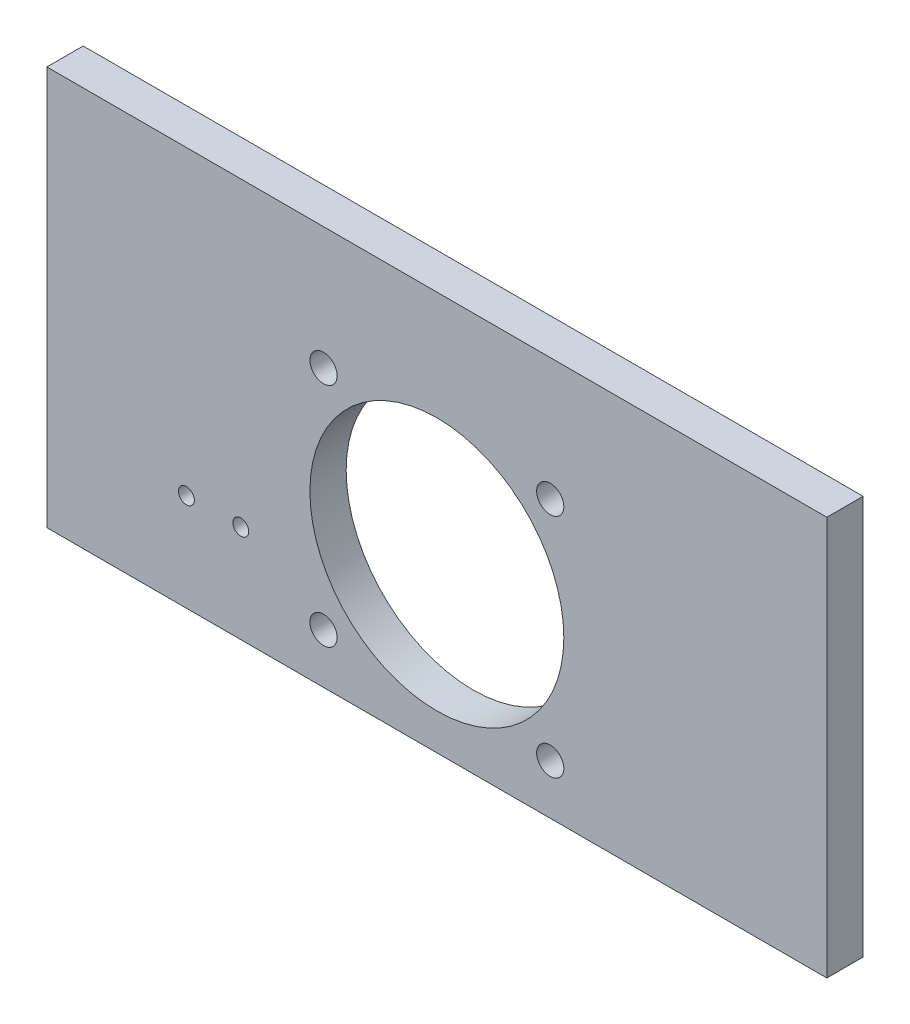
ISO-10303-21;
HEADER;
FILE_DESCRIPTION(('STEP AP214'),'2;1');
FILE_NAME('part.step','',(''),(''),'','','');
FILE_SCHEMA(('AUTOMOTIVE_DESIGN { 1 0 10303 214 1 1 1 1 }'));
ENDSEC;
DATA;
#1=APPLICATION_CONTEXT('core data for automotive mechanical design processes');
#2=APPLICATION_PROTOCOL_DEFINITION('international standard','automotive_design',2000,#1);
#3=PRODUCT_CONTEXT('',#1,'mechanical');
#4=PRODUCT('Part','Part','',(#3));
#5=PRODUCT_RELATED_PRODUCT_CATEGORY('part','',(#4));
#6=PRODUCT_DEFINITION_FORMATION('','',#4);
#7=PRODUCT_DEFINITION_CONTEXT('part definition',#1,'design');
#8=PRODUCT_DEFINITION('design','',#6,#7);
#9=PRODUCT_DEFINITION_SHAPE('','',#8);
#10=(LENGTH_UNIT() NAMED_UNIT(*) SI_UNIT(.MILLI.,.METRE.));
#11=(NAMED_UNIT(*) PLANE_ANGLE_UNIT() SI_UNIT($,.RADIAN.));
#12=(NAMED_UNIT(*) SI_UNIT($,.STERADIAN.) SOLID_ANGLE_UNIT());
#13=UNCERTAINTY_MEASURE_WITH_UNIT(LENGTH_MEASURE(1.E-05),#10,'distance_accuracy_value','');
#14=(GEOMETRIC_REPRESENTATION_CONTEXT(3) GLOBAL_UNCERTAINTY_ASSIGNED_CONTEXT((#13)) GLOBAL_UNIT_ASSIGNED_CONTEXT((#10,
#11,#12)) REPRESENTATION_CONTEXT('',''));
#15=CARTESIAN_POINT('',(0.,0.,0.));
#16=DIRECTION('',(0.,0.,1.));
#17=DIRECTION('',(1.,0.,0.));
#18=AXIS2_PLACEMENT_3D('',#15,#16,#17);
#19=CARTESIAN_POINT('',(0.,0.,4.));
#20=DIRECTION('',(1.,0.,0.));
#21=DIRECTION('',(0.,0.,-1.));
#22=AXIS2_PLACEMENT_3D('',#19,#20,#21);
#23=PLANE('',#22);
#24=DIRECTION('',(0.,-1.,0.));
#25=VECTOR('',#24,1.);
#26=CARTESIAN_POINT('',(0.,0.,0.));
#27=LINE('',#26,#25);
#28=CARTESIAN_POINT('',(0.,44.,0.));
#29=VERTEX_POINT('',#28);
#30=CARTESIAN_POINT('',(0.,0.,0.));
#31=VERTEX_POINT('',#30);
#32=EDGE_CURVE('E97',#29,#31,#27,.T.);
#33=ORIENTED_EDGE('',*,*,#32,.T.);
#34=DIRECTION('',(0.,0.,-1.));
#35=VECTOR('',#34,1.);
#36=CARTESIAN_POINT('',(0.,0.,4.));
#37=LINE('',#36,#35);
#38=CARTESIAN_POINT('',(0.,0.,4.));
#39=VERTEX_POINT('',#38);
#40=EDGE_CURVE('E11',#39,#31,#37,.T.);
#41=ORIENTED_EDGE('',*,*,#40,.F.);
#42=DIRECTION('',(0.,-1.,0.));
#43=VECTOR('',#42,1.);
#44=CARTESIAN_POINT('',(0.,0.,4.));
#45=LINE('',#44,#43);
#46=CARTESIAN_POINT('',(0.,44.,4.));
#47=VERTEX_POINT('',#46);
#48=EDGE_CURVE('E85',#47,#39,#45,.T.);
#49=ORIENTED_EDGE('',*,*,#48,.F.);
#50=DIRECTION('',(0.,0.,-1.));
#51=VECTOR('',#50,1.);
#52=CARTESIAN_POINT('',(0.,44.,4.));
#53=LINE('',#52,#51);
#54=EDGE_CURVE('E93',#47,#29,#53,.T.);
#55=ORIENTED_EDGE('',*,*,#54,.T.);
#56=EDGE_LOOP('',(#33,#41,#49,#55));
#57=FACE_BOUND('',#56,.T.);
#58=ADVANCED_FACE('F34',(#57),#23,.F.);
#59=CARTESIAN_POINT('',(0.,0.,4.));
#60=DIRECTION('',(0.,1.,0.));
#61=DIRECTION('',(0.,0.,1.));
#62=AXIS2_PLACEMENT_3D('',#59,#60,#61);
#63=PLANE('',#62);
#64=DIRECTION('',(1.,0.,0.));
#65=VECTOR('',#64,1.);
#66=CARTESIAN_POINT('',(0.,0.,0.));
#67=LINE('',#66,#65);
#68=CARTESIAN_POINT('',(86.,0.,0.));
#69=VERTEX_POINT('',#68);
#70=EDGE_CURVE('E89',#31,#69,#67,.T.);
#71=ORIENTED_EDGE('',*,*,#70,.T.);
#72=DIRECTION('',(0.,0.,-1.));
#73=VECTOR('',#72,1.);
#74=CARTESIAN_POINT('',(86.,0.,4.));
#75=LINE('',#74,#73);
#76=CARTESIAN_POINT('',(86.,0.,4.));
#77=VERTEX_POINT('',#76);
#78=EDGE_CURVE('E42',#77,#69,#75,.T.);
#79=ORIENTED_EDGE('',*,*,#78,.F.);
#80=DIRECTION('',(1.,0.,0.));
#81=VECTOR('',#80,1.);
#82=CARTESIAN_POINT('',(0.,0.,4.));
#83=LINE('',#82,#81);
#84=EDGE_CURVE('E80',#39,#77,#83,.T.);
#85=ORIENTED_EDGE('',*,*,#84,.F.);
#86=ORIENTED_EDGE('',*,*,#40,.T.);
#87=EDGE_LOOP('',(#71,#79,#85,#86));
#88=FACE_BOUND('',#87,.T.);
#89=ADVANCED_FACE('F88',(#88),#63,.F.);
#90=CARTESIAN_POINT('',(86.,0.,4.));
#91=DIRECTION('',(-1.,0.,0.));
#92=DIRECTION('',(0.,0.,1.));
#93=AXIS2_PLACEMENT_3D('',#90,#91,#92);
#94=PLANE('',#93);
#95=DIRECTION('',(0.,1.,0.));
#96=VECTOR('',#95,1.);
#97=CARTESIAN_POINT('',(86.,0.,0.));
#98=LINE('',#97,#96);
#99=CARTESIAN_POINT('',(86.,44.,0.));
#100=VERTEX_POINT('',#99);
#101=EDGE_CURVE('E67',#69,#100,#98,.T.);
#102=ORIENTED_EDGE('',*,*,#101,.T.);
#103=DIRECTION('',(0.,0.,-1.));
#104=VECTOR('',#103,1.);
#105=CARTESIAN_POINT('',(86.,44.,4.));
#106=LINE('',#105,#104);
#107=CARTESIAN_POINT('',(86.,44.,4.));
#108=VERTEX_POINT('',#107);
#109=EDGE_CURVE('E90',#108,#100,#106,.T.);
#110=ORIENTED_EDGE('',*,*,#109,.F.);
#111=DIRECTION('',(0.,1.,0.));
#112=VECTOR('',#111,1.);
#113=CARTESIAN_POINT('',(86.,0.,4.));
#114=LINE('',#113,#112);
#115=EDGE_CURVE('E83',#77,#108,#114,.T.);
#116=ORIENTED_EDGE('',*,*,#115,.F.);
#117=ORIENTED_EDGE('',*,*,#78,.T.);
#118=EDGE_LOOP('',(#102,#110,#116,#117));
#119=FACE_BOUND('',#118,.T.);
#120=ADVANCED_FACE('F91',(#119),#94,.F.);
#121=CARTESIAN_POINT('',(0.,44.,4.));
#122=DIRECTION('',(0.,-1.,0.));
#123=DIRECTION('',(0.,0.,-1.));
#124=AXIS2_PLACEMENT_3D('',#121,#122,#123);
#125=PLANE('',#124);
#126=DIRECTION('',(-1.,0.,0.));
#127=VECTOR('',#126,1.);
#128=CARTESIAN_POINT('',(0.,44.,0.));
#129=LINE('',#128,#127);
#130=EDGE_CURVE('E73',#100,#29,#129,.T.);
#131=ORIENTED_EDGE('',*,*,#130,.T.);
#132=ORIENTED_EDGE('',*,*,#54,.F.);
#133=DIRECTION('',(-1.,0.,0.));
#134=VECTOR('',#133,1.);
#135=CARTESIAN_POINT('',(0.,44.,4.));
#136=LINE('',#135,#134);
#137=EDGE_CURVE('E50',#108,#47,#136,.T.);
#138=ORIENTED_EDGE('',*,*,#137,.F.);
#139=ORIENTED_EDGE('',*,*,#109,.T.);
#140=EDGE_LOOP('',(#131,#132,#138,#139));
#141=FACE_BOUND('',#140,.T.);
#142=ADVANCED_FACE('F105',(#141),#125,.F.);
#143=CARTESIAN_POINT('',(0.,0.,4.));
#144=DIRECTION('',(0.,0.,-1.));
#145=DIRECTION('',(-1.,0.,0.));
#146=AXIS2_PLACEMENT_3D('',#143,#144,#145);
#147=PLANE('',#146);
#148=CARTESIAN_POINT('',(15.38,10.75,4.));
#149=DIRECTION('',(0.,0.,1.));
#150=DIRECTION('',(1.,0.,0.));
#151=AXIS2_PLACEMENT_3D('',#148,#149,#150);
#152=CIRCLE('',#151,0.875000000000001);
#153=CARTESIAN_POINT('',(16.255,10.75,4.));
#154=VERTEX_POINT('',#153);
#155=EDGE_CURVE('E149',#154,#154,#152,.T.);
#156=ORIENTED_EDGE('',*,*,#155,.F.);
#157=EDGE_LOOP('',(#156));
#158=FACE_BOUND('',#157,.T.);
#159=CARTESIAN_POINT('',(21.38,10.75,4.));
#160=DIRECTION('',(0.,0.,1.));
#161=DIRECTION('',(1.,0.,0.));
#162=AXIS2_PLACEMENT_3D('',#159,#160,#161);
#163=CIRCLE('',#162,0.875000000000001);
#164=CARTESIAN_POINT('',(22.255,10.75,4.));
#165=VERTEX_POINT('',#164);
#166=EDGE_CURVE('E143',#165,#165,#163,.T.);
#167=ORIENTED_EDGE('',*,*,#166,.F.);
#168=EDGE_LOOP('',(#167));
#169=FACE_BOUND('',#168,.T.);
#170=CARTESIAN_POINT('',(30.4999999999999,5.50000000000013,4.));
#171=DIRECTION('',(0.,0.,1.));
#172=DIRECTION('',(1.,0.,0.));
#173=AXIS2_PLACEMENT_3D('',#170,#171,#172);
#174=CIRCLE('',#173,1.50000000000002);
#175=CARTESIAN_POINT('',(31.9999999999999,5.50000000000013,4.));
#176=VERTEX_POINT('',#175);
#177=EDGE_CURVE('E123',#176,#176,#174,.T.);
#178=ORIENTED_EDGE('',*,*,#177,.F.);
#179=EDGE_LOOP('',(#178));
#180=FACE_BOUND('',#179,.T.);
#181=CARTESIAN_POINT('',(55.4999999999999,5.4999999999999,4.));
#182=DIRECTION('',(0.,0.,1.));
#183=DIRECTION('',(1.,0.,0.));
#184=AXIS2_PLACEMENT_3D('',#181,#182,#183);
#185=CIRCLE('',#184,1.50000000000002);
#186=CARTESIAN_POINT('',(56.9999999999999,5.4999999999999,4.));
#187=VERTEX_POINT('',#186);
#188=EDGE_CURVE('E130',#187,#187,#185,.T.);
#189=ORIENTED_EDGE('',*,*,#188,.F.);
#190=EDGE_LOOP('',(#189));
#191=FACE_BOUND('',#190,.T.);
#192=CARTESIAN_POINT('',(55.5,30.5,4.));
#193=DIRECTION('',(0.,0.,1.));
#194=DIRECTION('',(1.,0.,0.));
#195=AXIS2_PLACEMENT_3D('',#192,#193,#194);
#196=CIRCLE('',#195,1.50000000000002);
#197=CARTESIAN_POINT('',(57.,30.5,4.));
#198=VERTEX_POINT('',#197);
#199=EDGE_CURVE('E136',#198,#198,#196,.T.);
#200=ORIENTED_EDGE('',*,*,#199,.F.);
#201=EDGE_LOOP('',(#200));
#202=FACE_BOUND('',#201,.T.);
#203=CARTESIAN_POINT('',(30.5,30.5,4.));
#204=DIRECTION('',(0.,0.,1.));
#205=DIRECTION('',(1.,0.,0.));
#206=AXIS2_PLACEMENT_3D('',#203,#204,#205);
#207=CIRCLE('',#206,1.50000000000002);
#208=CARTESIAN_POINT('',(32.,30.5,4.));
#209=VERTEX_POINT('',#208);
#210=EDGE_CURVE('E117',#209,#209,#207,.T.);
#211=ORIENTED_EDGE('',*,*,#210,.F.);
#212=EDGE_LOOP('',(#211));
#213=FACE_BOUND('',#212,.T.);
#214=CARTESIAN_POINT('',(43.,18.,4.));
#215=DIRECTION('',(0.,0.,1.));
#216=DIRECTION('',(1.,0.,0.));
#217=AXIS2_PLACEMENT_3D('',#214,#215,#216);
#218=CIRCLE('',#217,14.);
#219=CARTESIAN_POINT('',(57.,18.,4.));
#220=VERTEX_POINT('',#219);
#221=EDGE_CURVE('E111',#220,#220,#218,.T.);
#222=ORIENTED_EDGE('',*,*,#221,.F.);
#223=EDGE_LOOP('',(#222));
#224=FACE_BOUND('',#223,.T.);
#225=ORIENTED_EDGE('',*,*,#48,.T.);
#226=ORIENTED_EDGE('',*,*,#84,.T.);
#227=ORIENTED_EDGE('',*,*,#115,.T.);
#228=ORIENTED_EDGE('',*,*,#137,.T.);
#229=EDGE_LOOP('',(#225,#226,#227,#228));
#230=FACE_BOUND('',#229,.T.);
#231=ADVANCED_FACE('F81',(#158,#169,#180,#191,#202,#213,#224,#230),#147,.F.);
#232=CARTESIAN_POINT('',(0.,0.,0.));
#233=DIRECTION('',(0.,0.,-1.));
#234=DIRECTION('',(-1.,0.,0.));
#235=AXIS2_PLACEMENT_3D('',#232,#233,#234);
#236=PLANE('',#235);
#237=CARTESIAN_POINT('',(15.38,10.75,0.));
#238=DIRECTION('',(0.,0.,1.));
#239=DIRECTION('',(1.,0.,0.));
#240=AXIS2_PLACEMENT_3D('',#237,#238,#239);
#241=CIRCLE('',#240,0.875000000000001);
#242=CARTESIAN_POINT('',(16.255,10.75,0.));
#243=VERTEX_POINT('',#242);
#244=EDGE_CURVE('E146',#243,#243,#241,.T.);
#245=ORIENTED_EDGE('',*,*,#244,.T.);
#246=EDGE_LOOP('',(#245));
#247=FACE_BOUND('',#246,.T.);
#248=CARTESIAN_POINT('',(21.38,10.75,0.));
#249=DIRECTION('',(0.,0.,1.));
#250=DIRECTION('',(1.,0.,0.));
#251=AXIS2_PLACEMENT_3D('',#248,#249,#250);
#252=CIRCLE('',#251,0.875000000000001);
#253=CARTESIAN_POINT('',(22.255,10.75,0.));
#254=VERTEX_POINT('',#253);
#255=EDGE_CURVE('E127',#254,#254,#252,.T.);
#256=ORIENTED_EDGE('',*,*,#255,.T.);
#257=EDGE_LOOP('',(#256));
#258=FACE_BOUND('',#257,.T.);
#259=CARTESIAN_POINT('',(30.4999999999999,5.50000000000013,0.));
#260=DIRECTION('',(0.,0.,1.));
#261=DIRECTION('',(1.,0.,0.));
#262=AXIS2_PLACEMENT_3D('',#259,#260,#261);
#263=CIRCLE('',#262,1.50000000000002);
#264=CARTESIAN_POINT('',(31.9999999999999,5.50000000000013,0.));
#265=VERTEX_POINT('',#264);
#266=EDGE_CURVE('E126',#265,#265,#263,.T.);
#267=ORIENTED_EDGE('',*,*,#266,.T.);
#268=EDGE_LOOP('',(#267));
#269=FACE_BOUND('',#268,.T.);
#270=CARTESIAN_POINT('',(55.4999999999999,5.4999999999999,0.));
#271=DIRECTION('',(0.,0.,1.));
#272=DIRECTION('',(1.,0.,0.));
#273=AXIS2_PLACEMENT_3D('',#270,#271,#272);
#274=CIRCLE('',#273,1.50000000000002);
#275=CARTESIAN_POINT('',(56.9999999999999,5.4999999999999,0.));
#276=VERTEX_POINT('',#275);
#277=EDGE_CURVE('E133',#276,#276,#274,.T.);
#278=ORIENTED_EDGE('',*,*,#277,.T.);
#279=EDGE_LOOP('',(#278));
#280=FACE_BOUND('',#279,.T.);
#281=CARTESIAN_POINT('',(55.5,30.5,0.));
#282=DIRECTION('',(0.,0.,1.));
#283=DIRECTION('',(1.,0.,0.));
#284=AXIS2_PLACEMENT_3D('',#281,#282,#283);
#285=CIRCLE('',#284,1.50000000000002);
#286=CARTESIAN_POINT('',(57.,30.5,0.));
#287=VERTEX_POINT('',#286);
#288=EDGE_CURVE('E120',#287,#287,#285,.T.);
#289=ORIENTED_EDGE('',*,*,#288,.T.);
#290=EDGE_LOOP('',(#289));
#291=FACE_BOUND('',#290,.T.);
#292=CARTESIAN_POINT('',(30.5,30.5,0.));
#293=DIRECTION('',(0.,0.,1.));
#294=DIRECTION('',(1.,0.,0.));
#295=AXIS2_PLACEMENT_3D('',#292,#293,#294);
#296=CIRCLE('',#295,1.50000000000002);
#297=CARTESIAN_POINT('',(32.,30.5,0.));
#298=VERTEX_POINT('',#297);
#299=EDGE_CURVE('E114',#298,#298,#296,.T.);
#300=ORIENTED_EDGE('',*,*,#299,.T.);
#301=EDGE_LOOP('',(#300));
#302=FACE_BOUND('',#301,.T.);
#303=CARTESIAN_POINT('',(43.,18.,0.));
#304=DIRECTION('',(0.,0.,1.));
#305=DIRECTION('',(1.,0.,0.));
#306=AXIS2_PLACEMENT_3D('',#303,#304,#305);
#307=CIRCLE('',#306,14.);
#308=CARTESIAN_POINT('',(57.,18.,0.));
#309=VERTEX_POINT('',#308);
#310=EDGE_CURVE('E100',#309,#309,#307,.T.);
#311=ORIENTED_EDGE('',*,*,#310,.T.);
#312=EDGE_LOOP('',(#311));
#313=FACE_BOUND('',#312,.T.);
#314=ORIENTED_EDGE('',*,*,#32,.F.);
#315=ORIENTED_EDGE('',*,*,#130,.F.);
#316=ORIENTED_EDGE('',*,*,#101,.F.);
#317=ORIENTED_EDGE('',*,*,#70,.F.);
#318=EDGE_LOOP('',(#314,#315,#316,#317));
#319=FACE_BOUND('',#318,.T.);
#320=ADVANCED_FACE('F108',(#247,#258,#269,#280,#291,#302,#313,#319),#236,.T.);
#321=CARTESIAN_POINT('',(43.,18.,0.));
#322=DIRECTION('',(0.,0.,1.));
#323=DIRECTION('',(1.,0.,0.));
#324=AXIS2_PLACEMENT_3D('',#321,#322,#323);
#325=CYLINDRICAL_SURFACE('',#324,14.);
#326=ORIENTED_EDGE('',*,*,#310,.F.);
#327=EDGE_LOOP('',(#326));
#328=FACE_BOUND('',#327,.T.);
#329=ORIENTED_EDGE('',*,*,#221,.T.);
#330=EDGE_LOOP('',(#329));
#331=FACE_BOUND('',#330,.T.);
#332=ADVANCED_FACE('F170',(#328,#331),#325,.F.);
#333=CARTESIAN_POINT('',(30.5,30.5,0.));
#334=DIRECTION('',(0.,0.,1.));
#335=DIRECTION('',(1.,0.,0.));
#336=AXIS2_PLACEMENT_3D('',#333,#334,#335);
#337=CYLINDRICAL_SURFACE('',#336,1.50000000000002);
#338=ORIENTED_EDGE('',*,*,#299,.F.);
#339=EDGE_LOOP('',(#338));
#340=FACE_BOUND('',#339,.T.);
#341=ORIENTED_EDGE('',*,*,#210,.T.);
#342=EDGE_LOOP('',(#341));
#343=FACE_BOUND('',#342,.T.);
#344=ADVANCED_FACE('F172',(#340,#343),#337,.F.);
#345=CARTESIAN_POINT('',(55.5,30.5,0.));
#346=DIRECTION('',(0.,0.,1.));
#347=DIRECTION('',(1.,0.,0.));
#348=AXIS2_PLACEMENT_3D('',#345,#346,#347);
#349=CYLINDRICAL_SURFACE('',#348,1.50000000000002);
#350=ORIENTED_EDGE('',*,*,#288,.F.);
#351=EDGE_LOOP('',(#350));
#352=FACE_BOUND('',#351,.T.);
#353=ORIENTED_EDGE('',*,*,#199,.T.);
#354=EDGE_LOOP('',(#353));
#355=FACE_BOUND('',#354,.T.);
#356=ADVANCED_FACE('F179',(#352,#355),#349,.F.);
#357=CARTESIAN_POINT('',(55.4999999999999,5.4999999999999,0.));
#358=DIRECTION('',(0.,0.,1.));
#359=DIRECTION('',(1.,0.,0.));
#360=AXIS2_PLACEMENT_3D('',#357,#358,#359);
#361=CYLINDRICAL_SURFACE('',#360,1.50000000000002);
#362=ORIENTED_EDGE('',*,*,#277,.F.);
#363=EDGE_LOOP('',(#362));
#364=FACE_BOUND('',#363,.T.);
#365=ORIENTED_EDGE('',*,*,#188,.T.);
#366=EDGE_LOOP('',(#365));
#367=FACE_BOUND('',#366,.T.);
#368=ADVANCED_FACE('F239',(#364,#367),#361,.F.);
#369=CARTESIAN_POINT('',(30.4999999999999,5.50000000000013,0.));
#370=DIRECTION('',(0.,0.,1.));
#371=DIRECTION('',(1.,0.,0.));
#372=AXIS2_PLACEMENT_3D('',#369,#370,#371);
#373=CYLINDRICAL_SURFACE('',#372,1.50000000000002);
#374=ORIENTED_EDGE('',*,*,#266,.F.);
#375=EDGE_LOOP('',(#374));
#376=FACE_BOUND('',#375,.T.);
#377=ORIENTED_EDGE('',*,*,#177,.T.);
#378=EDGE_LOOP('',(#377));
#379=FACE_BOUND('',#378,.T.);
#380=ADVANCED_FACE('F219',(#376,#379),#373,.F.);
#381=CARTESIAN_POINT('',(21.38,10.75,4.));
#382=DIRECTION('',(0.,0.,1.));
#383=DIRECTION('',(1.,0.,0.));
#384=AXIS2_PLACEMENT_3D('',#381,#382,#383);
#385=CYLINDRICAL_SURFACE('',#384,0.875000000000001);
#386=ORIENTED_EDGE('',*,*,#255,.F.);
#387=EDGE_LOOP('',(#386));
#388=FACE_BOUND('',#387,.T.);
#389=ORIENTED_EDGE('',*,*,#166,.T.);
#390=EDGE_LOOP('',(#389));
#391=FACE_BOUND('',#390,.T.);
#392=ADVANCED_FACE('F214',(#388,#391),#385,.F.);
#393=CARTESIAN_POINT('',(15.38,10.75,4.));
#394=DIRECTION('',(0.,0.,1.));
#395=DIRECTION('',(1.,0.,0.));
#396=AXIS2_PLACEMENT_3D('',#393,#394,#395);
#397=CYLINDRICAL_SURFACE('',#396,0.875000000000001);
#398=ORIENTED_EDGE('',*,*,#244,.F.);
#399=EDGE_LOOP('',(#398));
#400=FACE_BOUND('',#399,.T.);
#401=ORIENTED_EDGE('',*,*,#155,.T.);
#402=EDGE_LOOP('',(#401));
#403=FACE_BOUND('',#402,.T.);
#404=ADVANCED_FACE('F153',(#400,#403),#397,.F.);
#405=CLOSED_SHELL('',(#58,#89,#120,#142,#231,#320,#332,#344,#356,#368,#380,#392,#404));
#406=MANIFOLD_SOLID_BREP('B2',#405);
#407=ADVANCED_BREP_SHAPE_REPRESENTATION('',(#18,#406),#14);
#408=SHAPE_DEFINITION_REPRESENTATION(#9,#407);
ENDSEC;
END-ISO-10303-21;
